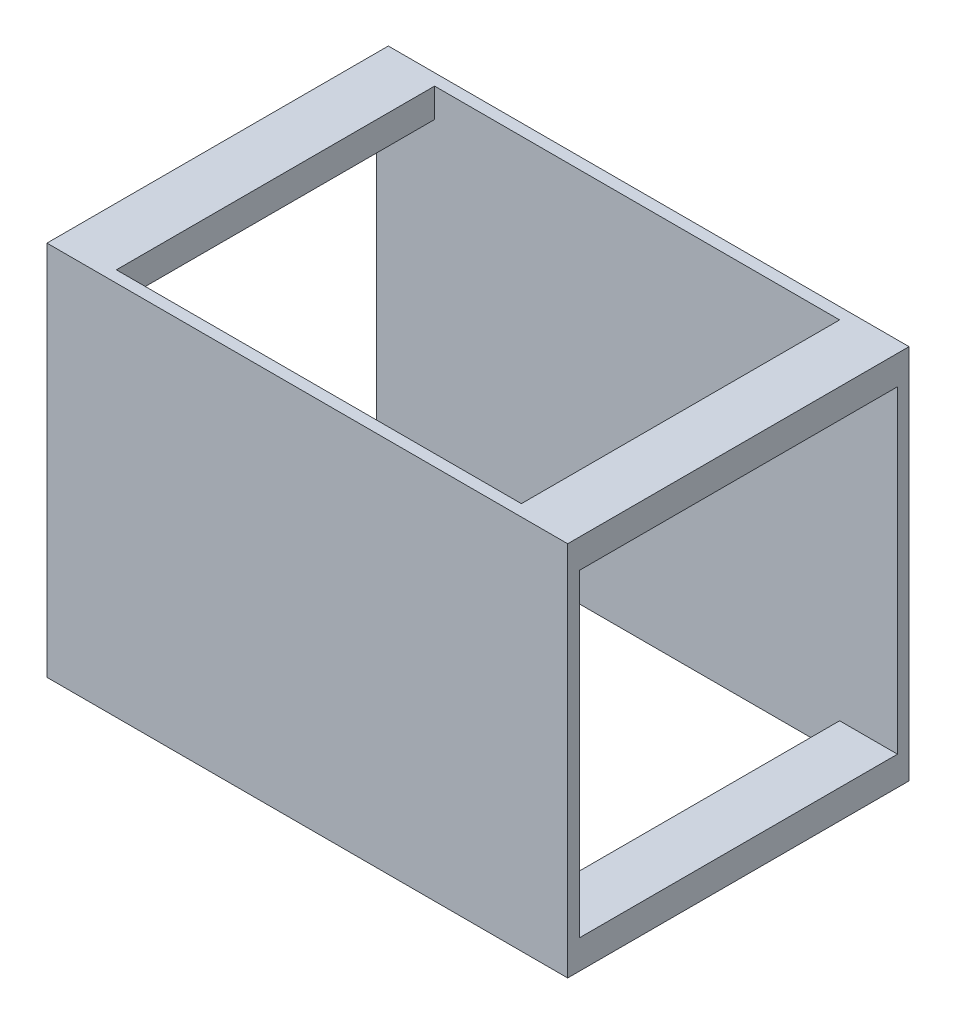
ISO-10303-21;
HEADER;
FILE_DESCRIPTION(('STEP AP214'),'2;1');
FILE_NAME('part.step','',(''),(''),'','','');
FILE_SCHEMA(('AUTOMOTIVE_DESIGN { 1 0 10303 214 1 1 1 1 }'));
ENDSEC;
DATA;
#1=APPLICATION_CONTEXT('core data for automotive mechanical design processes');
#2=APPLICATION_PROTOCOL_DEFINITION('international standard','automotive_design',2000,#1);
#3=PRODUCT_CONTEXT('',#1,'mechanical');
#4=PRODUCT('Part','Part','',(#3));
#5=PRODUCT_RELATED_PRODUCT_CATEGORY('part','',(#4));
#6=PRODUCT_DEFINITION_FORMATION('','',#4);
#7=PRODUCT_DEFINITION_CONTEXT('part definition',#1,'design');
#8=PRODUCT_DEFINITION('design','',#6,#7);
#9=PRODUCT_DEFINITION_SHAPE('','',#8);
#10=(LENGTH_UNIT() NAMED_UNIT(*) SI_UNIT(.MILLI.,.METRE.));
#11=(NAMED_UNIT(*) PLANE_ANGLE_UNIT() SI_UNIT($,.RADIAN.));
#12=(NAMED_UNIT(*) SI_UNIT($,.STERADIAN.) SOLID_ANGLE_UNIT());
#13=UNCERTAINTY_MEASURE_WITH_UNIT(LENGTH_MEASURE(1.E-05),#10,'distance_accuracy_value','');
#14=(GEOMETRIC_REPRESENTATION_CONTEXT(3) GLOBAL_UNCERTAINTY_ASSIGNED_CONTEXT((#13)) GLOBAL_UNIT_ASSIGNED_CONTEXT((#10,
#11,#12)) REPRESENTATION_CONTEXT('',''));
#15=CARTESIAN_POINT('',(0.,0.,0.));
#16=DIRECTION('',(0.,0.,1.));
#17=DIRECTION('',(1.,0.,0.));
#18=AXIS2_PLACEMENT_3D('',#15,#16,#17);
#19=CARTESIAN_POINT('',(0.,0.,2.));
#20=DIRECTION('',(0.,0.,1.));
#21=DIRECTION('',(1.,0.,0.));
#22=AXIS2_PLACEMENT_3D('',#19,#20,#21);
#23=PLANE('',#22);
#24=DIRECTION('',(0.,-1.,0.));
#25=VECTOR('',#24,1.);
#26=CARTESIAN_POINT('',(35.,-32.5,2.));
#27=LINE('',#26,#25);
#28=CARTESIAN_POINT('',(35.,-27.5,2.));
#29=VERTEX_POINT('',#28);
#30=CARTESIAN_POINT('',(35.,-32.5,2.));
#31=VERTEX_POINT('',#30);
#32=EDGE_CURVE('E61',#29,#31,#27,.T.);
#33=ORIENTED_EDGE('',*,*,#32,.F.);
#34=DIRECTION('',(-1.,0.,0.));
#35=VECTOR('',#34,1.);
#36=CARTESIAN_POINT('',(45.,-27.5,2.));
#37=LINE('',#36,#35);
#38=CARTESIAN_POINT('',(45.,-27.5,2.));
#39=VERTEX_POINT('',#38);
#40=EDGE_CURVE('E65',#39,#29,#37,.T.);
#41=ORIENTED_EDGE('',*,*,#40,.F.);
#42=DIRECTION('',(0.,1.,0.));
#43=VECTOR('',#42,1.);
#44=CARTESIAN_POINT('',(45.,32.5,2.));
#45=LINE('',#44,#43);
#46=CARTESIAN_POINT('',(45.,27.5,2.));
#47=VERTEX_POINT('',#46);
#48=EDGE_CURVE('E306',#39,#47,#45,.T.);
#49=ORIENTED_EDGE('',*,*,#48,.T.);
#50=DIRECTION('',(-1.,0.,0.));
#51=VECTOR('',#50,1.);
#52=CARTESIAN_POINT('',(45.,27.5,2.));
#53=LINE('',#52,#51);
#54=CARTESIAN_POINT('',(35.,27.5,2.));
#55=VERTEX_POINT('',#54);
#56=EDGE_CURVE('E232',#47,#55,#53,.T.);
#57=ORIENTED_EDGE('',*,*,#56,.T.);
#58=DIRECTION('',(0.,1.,0.));
#59=VECTOR('',#58,1.);
#60=CARTESIAN_POINT('',(35.,32.5,2.));
#61=LINE('',#60,#59);
#62=CARTESIAN_POINT('',(35.,32.5,2.));
#63=VERTEX_POINT('',#62);
#64=EDGE_CURVE('E226',#55,#63,#61,.T.);
#65=ORIENTED_EDGE('',*,*,#64,.T.);
#66=DIRECTION('',(-1.,0.,0.));
#67=VECTOR('',#66,1.);
#68=CARTESIAN_POINT('',(-45.,32.5,2.));
#69=LINE('',#68,#67);
#70=CARTESIAN_POINT('',(-35.,32.5,2.));
#71=VERTEX_POINT('',#70);
#72=EDGE_CURVE('E309',#63,#71,#69,.T.);
#73=ORIENTED_EDGE('',*,*,#72,.T.);
#74=DIRECTION('',(0.,1.,0.));
#75=VECTOR('',#74,1.);
#76=CARTESIAN_POINT('',(-35.,32.5,2.));
#77=LINE('',#76,#75);
#78=CARTESIAN_POINT('',(-35.,27.5,2.));
#79=VERTEX_POINT('',#78);
#80=EDGE_CURVE('E284',#79,#71,#77,.T.);
#81=ORIENTED_EDGE('',*,*,#80,.F.);
#82=DIRECTION('',(1.,0.,0.));
#83=VECTOR('',#82,1.);
#84=CARTESIAN_POINT('',(-45.,27.5,2.));
#85=LINE('',#84,#83);
#86=CARTESIAN_POINT('',(-45.,27.5,2.));
#87=VERTEX_POINT('',#86);
#88=EDGE_CURVE('E278',#87,#79,#85,.T.);
#89=ORIENTED_EDGE('',*,*,#88,.F.);
#90=DIRECTION('',(0.,-1.,0.));
#91=VECTOR('',#90,1.);
#92=CARTESIAN_POINT('',(-45.,32.5,2.));
#93=LINE('',#92,#91);
#94=CARTESIAN_POINT('',(-45.,-27.5,2.));
#95=VERTEX_POINT('',#94);
#96=EDGE_CURVE('E313',#87,#95,#93,.T.);
#97=ORIENTED_EDGE('',*,*,#96,.T.);
#98=DIRECTION('',(1.,0.,0.));
#99=VECTOR('',#98,1.);
#100=CARTESIAN_POINT('',(-45.,-27.5,2.));
#101=LINE('',#100,#99);
#102=CARTESIAN_POINT('',(-35.,-27.5,2.));
#103=VERTEX_POINT('',#102);
#104=EDGE_CURVE('E258',#95,#103,#101,.T.);
#105=ORIENTED_EDGE('',*,*,#104,.T.);
#106=DIRECTION('',(0.,-1.,0.));
#107=VECTOR('',#106,1.);
#108=CARTESIAN_POINT('',(-35.,-32.5,2.));
#109=LINE('',#108,#107);
#110=CARTESIAN_POINT('',(-35.,-32.5,2.));
#111=VERTEX_POINT('',#110);
#112=EDGE_CURVE('E252',#103,#111,#109,.T.);
#113=ORIENTED_EDGE('',*,*,#112,.T.);
#114=DIRECTION('',(1.,0.,0.));
#115=VECTOR('',#114,1.);
#116=CARTESIAN_POINT('',(-45.,-32.5,2.));
#117=LINE('',#116,#115);
#118=EDGE_CURVE('E316',#111,#31,#117,.T.);
#119=ORIENTED_EDGE('',*,*,#118,.T.);
#120=EDGE_LOOP('',(#33,#41,#49,#57,#65,#73,#81,#89,#97,#105,#113,#119));
#121=FACE_BOUND('',#120,.T.);
#122=ADVANCED_FACE('F45',(#121),#23,.T.);
#123=CARTESIAN_POINT('',(45.,32.5,2.));
#124=DIRECTION('',(-1.,0.,0.));
#125=DIRECTION('',(0.,-1.,0.));
#126=AXIS2_PLACEMENT_3D('',#123,#124,#125);
#127=PLANE('',#126);
#128=DIRECTION('',(0.,1.,0.));
#129=VECTOR('',#128,1.);
#130=CARTESIAN_POINT('',(45.,32.5,57.));
#131=LINE('',#130,#129);
#132=CARTESIAN_POINT('',(45.,-27.5,57.));
#133=VERTEX_POINT('',#132);
#134=CARTESIAN_POINT('',(45.,27.5,57.));
#135=VERTEX_POINT('',#134);
#136=EDGE_CURVE('E191',#133,#135,#131,.T.);
#137=ORIENTED_EDGE('',*,*,#136,.T.);
#138=DIRECTION('',(0.,0.,-1.));
#139=VECTOR('',#138,1.);
#140=CARTESIAN_POINT('',(45.,27.5,57.));
#141=LINE('',#140,#139);
#142=EDGE_CURVE('E236',#135,#47,#141,.T.);
#143=ORIENTED_EDGE('',*,*,#142,.T.);
#144=ORIENTED_EDGE('',*,*,#48,.F.);
#145=DIRECTION('',(0.,0.,-1.));
#146=VECTOR('',#145,1.);
#147=CARTESIAN_POINT('',(45.,-27.5,57.));
#148=LINE('',#147,#146);
#149=EDGE_CURVE('E222',#133,#39,#148,.T.);
#150=ORIENTED_EDGE('',*,*,#149,.F.);
#151=EDGE_LOOP('',(#137,#143,#144,#150));
#152=FACE_BOUND('',#151,.T.);
#153=DIRECTION('',(0.,1.,0.));
#154=VECTOR('',#153,1.);
#155=CARTESIAN_POINT('',(45.,32.5,0.));
#156=LINE('',#155,#154);
#157=CARTESIAN_POINT('',(45.,-32.5,0.));
#158=VERTEX_POINT('',#157);
#159=CARTESIAN_POINT('',(45.,32.5,0.));
#160=VERTEX_POINT('',#159);
#161=EDGE_CURVE('E162',#158,#160,#156,.T.);
#162=ORIENTED_EDGE('',*,*,#161,.T.);
#163=DIRECTION('',(0.,0.,-1.));
#164=VECTOR('',#163,1.);
#165=CARTESIAN_POINT('',(45.,32.5,2.));
#166=LINE('',#165,#164);
#167=CARTESIAN_POINT('',(45.,32.5,59.));
#168=VERTEX_POINT('',#167);
#169=EDGE_CURVE('E11',#168,#160,#166,.T.);
#170=ORIENTED_EDGE('',*,*,#169,.F.);
#171=DIRECTION('',(0.,1.,0.));
#172=VECTOR('',#171,1.);
#173=CARTESIAN_POINT('',(45.,32.5,59.));
#174=LINE('',#173,#172);
#175=CARTESIAN_POINT('',(45.,-32.5,59.));
#176=VERTEX_POINT('',#175);
#177=EDGE_CURVE('E160',#176,#168,#174,.T.);
#178=ORIENTED_EDGE('',*,*,#177,.F.);
#179=DIRECTION('',(0.,0.,-1.));
#180=VECTOR('',#179,1.);
#181=CARTESIAN_POINT('',(45.,-32.5,2.));
#182=LINE('',#181,#180);
#183=EDGE_CURVE('E319',#176,#158,#182,.T.);
#184=ORIENTED_EDGE('',*,*,#183,.T.);
#185=EDGE_LOOP('',(#162,#170,#178,#184));
#186=FACE_BOUND('',#185,.T.);
#187=ADVANCED_FACE('F47',(#152,#186),#127,.F.);
#188=CARTESIAN_POINT('',(-45.,32.5,2.));
#189=DIRECTION('',(0.,-1.,0.));
#190=DIRECTION('',(0.,0.,-1.));
#191=AXIS2_PLACEMENT_3D('',#188,#189,#190);
#192=PLANE('',#191);
#193=DIRECTION('',(0.,0.,-1.));
#194=VECTOR('',#193,1.);
#195=CARTESIAN_POINT('',(-45.,32.5,2.));
#196=LINE('',#195,#194);
#197=CARTESIAN_POINT('',(-45.,32.5,59.));
#198=VERTEX_POINT('',#197);
#199=CARTESIAN_POINT('',(-45.,32.5,0.));
#200=VERTEX_POINT('',#199);
#201=EDGE_CURVE('E54',#198,#200,#196,.T.);
#202=ORIENTED_EDGE('',*,*,#201,.F.);
#203=DIRECTION('',(-1.,0.,0.));
#204=VECTOR('',#203,1.);
#205=CARTESIAN_POINT('',(-45.,32.5,59.));
#206=LINE('',#205,#204);
#207=EDGE_CURVE('E165',#168,#198,#206,.T.);
#208=ORIENTED_EDGE('',*,*,#207,.F.);
#209=ORIENTED_EDGE('',*,*,#169,.T.);
#210=DIRECTION('',(-1.,0.,0.));
#211=VECTOR('',#210,1.);
#212=CARTESIAN_POINT('',(-45.,32.5,0.));
#213=LINE('',#212,#211);
#214=EDGE_CURVE('E322',#160,#200,#213,.T.);
#215=ORIENTED_EDGE('',*,*,#214,.T.);
#216=EDGE_LOOP('',(#202,#208,#209,#215));
#217=FACE_BOUND('',#216,.T.);
#218=DIRECTION('',(-1.,0.,0.));
#219=VECTOR('',#218,1.);
#220=CARTESIAN_POINT('',(-45.,32.5,57.));
#221=LINE('',#220,#219);
#222=CARTESIAN_POINT('',(35.,32.5,57.));
#223=VERTEX_POINT('',#222);
#224=CARTESIAN_POINT('',(-35.,32.5,57.));
#225=VERTEX_POINT('',#224);
#226=EDGE_CURVE('E195',#223,#225,#221,.T.);
#227=ORIENTED_EDGE('',*,*,#226,.T.);
#228=DIRECTION('',(0.,0.,-1.));
#229=VECTOR('',#228,1.);
#230=CARTESIAN_POINT('',(-35.,32.5,57.));
#231=LINE('',#230,#229);
#232=EDGE_CURVE('E288',#225,#71,#231,.T.);
#233=ORIENTED_EDGE('',*,*,#232,.T.);
#234=ORIENTED_EDGE('',*,*,#72,.F.);
#235=DIRECTION('',(0.,0.,-1.));
#236=VECTOR('',#235,1.);
#237=CARTESIAN_POINT('',(35.,32.5,57.));
#238=LINE('',#237,#236);
#239=EDGE_CURVE('E248',#223,#63,#238,.T.);
#240=ORIENTED_EDGE('',*,*,#239,.F.);
#241=EDGE_LOOP('',(#227,#233,#234,#240));
#242=FACE_BOUND('',#241,.T.);
#243=ADVANCED_FACE('F166',(#217,#242),#192,.F.);
#244=CARTESIAN_POINT('',(-45.,32.5,2.));
#245=DIRECTION('',(1.,0.,0.));
#246=DIRECTION('',(0.,0.,-1.));
#247=AXIS2_PLACEMENT_3D('',#244,#245,#246);
#248=PLANE('',#247);
#249=DIRECTION('',(0.,0.,-1.));
#250=VECTOR('',#249,1.);
#251=CARTESIAN_POINT('',(-45.,27.5,57.));
#252=LINE('',#251,#250);
#253=CARTESIAN_POINT('',(-45.,27.5,57.));
#254=VERTEX_POINT('',#253);
#255=EDGE_CURVE('E302',#254,#87,#252,.T.);
#256=ORIENTED_EDGE('',*,*,#255,.F.);
#257=DIRECTION('',(0.,-1.,0.));
#258=VECTOR('',#257,1.);
#259=CARTESIAN_POINT('',(-45.,32.5,57.));
#260=LINE('',#259,#258);
#261=CARTESIAN_POINT('',(-45.,-27.5,57.));
#262=VERTEX_POINT('',#261);
#263=EDGE_CURVE('E184',#254,#262,#260,.T.);
#264=ORIENTED_EDGE('',*,*,#263,.T.);
#265=DIRECTION('',(0.,0.,-1.));
#266=VECTOR('',#265,1.);
#267=CARTESIAN_POINT('',(-45.,-27.5,57.));
#268=LINE('',#267,#266);
#269=EDGE_CURVE('E262',#262,#95,#268,.T.);
#270=ORIENTED_EDGE('',*,*,#269,.T.);
#271=ORIENTED_EDGE('',*,*,#96,.F.);
#272=EDGE_LOOP('',(#256,#264,#270,#271));
#273=FACE_BOUND('',#272,.T.);
#274=DIRECTION('',(0.,-1.,0.));
#275=VECTOR('',#274,1.);
#276=CARTESIAN_POINT('',(-45.,32.5,0.));
#277=LINE('',#276,#275);
#278=CARTESIAN_POINT('',(-45.,-32.5,0.));
#279=VERTEX_POINT('',#278);
#280=EDGE_CURVE('E325',#200,#279,#277,.T.);
#281=ORIENTED_EDGE('',*,*,#280,.T.);
#282=DIRECTION('',(0.,0.,-1.));
#283=VECTOR('',#282,1.);
#284=CARTESIAN_POINT('',(-45.,-32.5,2.));
#285=LINE('',#284,#283);
#286=CARTESIAN_POINT('',(-45.,-32.5,59.));
#287=VERTEX_POINT('',#286);
#288=EDGE_CURVE('E332',#287,#279,#285,.T.);
#289=ORIENTED_EDGE('',*,*,#288,.F.);
#290=DIRECTION('',(0.,-1.,0.));
#291=VECTOR('',#290,1.);
#292=CARTESIAN_POINT('',(-45.,32.5,59.));
#293=LINE('',#292,#291);
#294=EDGE_CURVE('E173',#198,#287,#293,.T.);
#295=ORIENTED_EDGE('',*,*,#294,.F.);
#296=ORIENTED_EDGE('',*,*,#201,.T.);
#297=EDGE_LOOP('',(#281,#289,#295,#296));
#298=FACE_BOUND('',#297,.T.);
#299=ADVANCED_FACE('F338',(#273,#298),#248,.F.);
#300=CARTESIAN_POINT('',(-45.,-32.5,2.));
#301=DIRECTION('',(0.,1.,0.));
#302=DIRECTION('',(0.,0.,1.));
#303=AXIS2_PLACEMENT_3D('',#300,#301,#302);
#304=PLANE('',#303);
#305=DIRECTION('',(1.,0.,0.));
#306=VECTOR('',#305,1.);
#307=CARTESIAN_POINT('',(-45.,-32.5,59.));
#308=LINE('',#307,#306);
#309=EDGE_CURVE('E178',#287,#176,#308,.T.);
#310=ORIENTED_EDGE('',*,*,#309,.F.);
#311=ORIENTED_EDGE('',*,*,#288,.T.);
#312=DIRECTION('',(1.,0.,0.));
#313=VECTOR('',#312,1.);
#314=CARTESIAN_POINT('',(-45.,-32.5,0.));
#315=LINE('',#314,#313);
#316=EDGE_CURVE('E310',#279,#158,#315,.T.);
#317=ORIENTED_EDGE('',*,*,#316,.T.);
#318=ORIENTED_EDGE('',*,*,#183,.F.);
#319=EDGE_LOOP('',(#310,#311,#317,#318));
#320=FACE_BOUND('',#319,.T.);
#321=DIRECTION('',(0.,0.,-1.));
#322=VECTOR('',#321,1.);
#323=CARTESIAN_POINT('',(-35.,-32.5,57.));
#324=LINE('',#323,#322);
#325=CARTESIAN_POINT('',(-35.,-32.5,57.));
#326=VERTEX_POINT('',#325);
#327=EDGE_CURVE('E274',#326,#111,#324,.T.);
#328=ORIENTED_EDGE('',*,*,#327,.F.);
#329=DIRECTION('',(1.,0.,0.));
#330=VECTOR('',#329,1.);
#331=CARTESIAN_POINT('',(-45.,-32.5,57.));
#332=LINE('',#331,#330);
#333=CARTESIAN_POINT('',(35.,-32.5,57.));
#334=VERTEX_POINT('',#333);
#335=EDGE_CURVE('E180',#326,#334,#332,.T.);
#336=ORIENTED_EDGE('',*,*,#335,.T.);
#337=DIRECTION('',(0.,0.,-1.));
#338=VECTOR('',#337,1.);
#339=CARTESIAN_POINT('',(35.,-32.5,57.));
#340=LINE('',#339,#338);
#341=EDGE_CURVE('E210',#334,#31,#340,.T.);
#342=ORIENTED_EDGE('',*,*,#341,.T.);
#343=ORIENTED_EDGE('',*,*,#118,.F.);
#344=EDGE_LOOP('',(#328,#336,#342,#343));
#345=FACE_BOUND('',#344,.T.);
#346=ADVANCED_FACE('F343',(#320,#345),#304,.F.);
#347=CARTESIAN_POINT('',(0.,0.,0.));
#348=DIRECTION('',(0.,0.,1.));
#349=DIRECTION('',(1.,0.,0.));
#350=AXIS2_PLACEMENT_3D('',#347,#348,#349);
#351=PLANE('',#350);
#352=ORIENTED_EDGE('',*,*,#161,.F.);
#353=ORIENTED_EDGE('',*,*,#316,.F.);
#354=ORIENTED_EDGE('',*,*,#280,.F.);
#355=ORIENTED_EDGE('',*,*,#214,.F.);
#356=EDGE_LOOP('',(#352,#353,#354,#355));
#357=FACE_BOUND('',#356,.T.);
#358=ADVANCED_FACE('F341',(#357),#351,.F.);
#359=CARTESIAN_POINT('',(-45.,27.5,57.));
#360=DIRECTION('',(0.,1.,0.));
#361=DIRECTION('',(0.,0.,1.));
#362=AXIS2_PLACEMENT_3D('',#359,#360,#361);
#363=PLANE('',#362);
#364=ORIENTED_EDGE('',*,*,#88,.T.);
#365=DIRECTION('',(0.,0.,-1.));
#366=VECTOR('',#365,1.);
#367=CARTESIAN_POINT('',(-35.,27.5,57.));
#368=LINE('',#367,#366);
#369=CARTESIAN_POINT('',(-35.,27.5,57.));
#370=VERTEX_POINT('',#369);
#371=EDGE_CURVE('E298',#370,#79,#368,.T.);
#372=ORIENTED_EDGE('',*,*,#371,.F.);
#373=DIRECTION('',(1.,0.,0.));
#374=VECTOR('',#373,1.);
#375=CARTESIAN_POINT('',(-45.,27.5,57.));
#376=LINE('',#375,#374);
#377=EDGE_CURVE('E279',#254,#370,#376,.T.);
#378=ORIENTED_EDGE('',*,*,#377,.F.);
#379=ORIENTED_EDGE('',*,*,#255,.T.);
#380=EDGE_LOOP('',(#364,#372,#378,#379));
#381=FACE_BOUND('',#380,.T.);
#382=ADVANCED_FACE('F392',(#381),#363,.F.);
#383=CARTESIAN_POINT('',(-35.,32.5,57.));
#384=DIRECTION('',(-1.,0.,0.));
#385=DIRECTION('',(0.,0.,1.));
#386=AXIS2_PLACEMENT_3D('',#383,#384,#385);
#387=PLANE('',#386);
#388=ORIENTED_EDGE('',*,*,#80,.T.);
#389=ORIENTED_EDGE('',*,*,#232,.F.);
#390=DIRECTION('',(0.,1.,0.));
#391=VECTOR('',#390,1.);
#392=CARTESIAN_POINT('',(-35.,32.5,57.));
#393=LINE('',#392,#391);
#394=EDGE_CURVE('E283',#370,#225,#393,.T.);
#395=ORIENTED_EDGE('',*,*,#394,.F.);
#396=ORIENTED_EDGE('',*,*,#371,.T.);
#397=EDGE_LOOP('',(#388,#389,#395,#396));
#398=FACE_BOUND('',#397,.T.);
#399=ADVANCED_FACE('F420',(#398),#387,.F.);
#400=CARTESIAN_POINT('',(-35.,-32.5,57.));
#401=DIRECTION('',(1.,0.,0.));
#402=DIRECTION('',(0.,0.,-1.));
#403=AXIS2_PLACEMENT_3D('',#400,#401,#402);
#404=PLANE('',#403);
#405=ORIENTED_EDGE('',*,*,#112,.F.);
#406=DIRECTION('',(0.,0.,-1.));
#407=VECTOR('',#406,1.);
#408=CARTESIAN_POINT('',(-35.,-27.5,57.));
#409=LINE('',#408,#407);
#410=CARTESIAN_POINT('',(-35.,-27.5,57.));
#411=VERTEX_POINT('',#410);
#412=EDGE_CURVE('E270',#411,#103,#409,.T.);
#413=ORIENTED_EDGE('',*,*,#412,.F.);
#414=DIRECTION('',(0.,-1.,0.));
#415=VECTOR('',#414,1.);
#416=CARTESIAN_POINT('',(-35.,-32.5,57.));
#417=LINE('',#416,#415);
#418=EDGE_CURVE('E253',#411,#326,#417,.T.);
#419=ORIENTED_EDGE('',*,*,#418,.T.);
#420=ORIENTED_EDGE('',*,*,#327,.T.);
#421=EDGE_LOOP('',(#405,#413,#419,#420));
#422=FACE_BOUND('',#421,.T.);
#423=ADVANCED_FACE('F352',(#422),#404,.T.);
#424=CARTESIAN_POINT('',(-45.,-27.5,57.));
#425=DIRECTION('',(0.,1.,0.));
#426=DIRECTION('',(0.,0.,1.));
#427=AXIS2_PLACEMENT_3D('',#424,#425,#426);
#428=PLANE('',#427);
#429=ORIENTED_EDGE('',*,*,#104,.F.);
#430=ORIENTED_EDGE('',*,*,#269,.F.);
#431=DIRECTION('',(1.,0.,0.));
#432=VECTOR('',#431,1.);
#433=CARTESIAN_POINT('',(-45.,-27.5,57.));
#434=LINE('',#433,#432);
#435=EDGE_CURVE('E257',#262,#411,#434,.T.);
#436=ORIENTED_EDGE('',*,*,#435,.T.);
#437=ORIENTED_EDGE('',*,*,#412,.T.);
#438=EDGE_LOOP('',(#429,#430,#436,#437));
#439=FACE_BOUND('',#438,.T.);
#440=ADVANCED_FACE('F375',(#439),#428,.T.);
#441=CARTESIAN_POINT('',(35.,32.5,57.));
#442=DIRECTION('',(-1.,0.,0.));
#443=DIRECTION('',(0.,0.,1.));
#444=AXIS2_PLACEMENT_3D('',#441,#442,#443);
#445=PLANE('',#444);
#446=ORIENTED_EDGE('',*,*,#64,.F.);
#447=DIRECTION('',(0.,0.,-1.));
#448=VECTOR('',#447,1.);
#449=CARTESIAN_POINT('',(35.,27.5,57.));
#450=LINE('',#449,#448);
#451=CARTESIAN_POINT('',(35.,27.5,57.));
#452=VERTEX_POINT('',#451);
#453=EDGE_CURVE('E244',#452,#55,#450,.T.);
#454=ORIENTED_EDGE('',*,*,#453,.F.);
#455=DIRECTION('',(0.,1.,0.));
#456=VECTOR('',#455,1.);
#457=CARTESIAN_POINT('',(35.,32.5,57.));
#458=LINE('',#457,#456);
#459=EDGE_CURVE('E227',#452,#223,#458,.T.);
#460=ORIENTED_EDGE('',*,*,#459,.T.);
#461=ORIENTED_EDGE('',*,*,#239,.T.);
#462=EDGE_LOOP('',(#446,#454,#460,#461));
#463=FACE_BOUND('',#462,.T.);
#464=ADVANCED_FACE('F373',(#463),#445,.T.);
#465=CARTESIAN_POINT('',(45.,27.5,57.));
#466=DIRECTION('',(0.,-1.,0.));
#467=DIRECTION('',(0.,0.,-1.));
#468=AXIS2_PLACEMENT_3D('',#465,#466,#467);
#469=PLANE('',#468);
#470=ORIENTED_EDGE('',*,*,#56,.F.);
#471=ORIENTED_EDGE('',*,*,#142,.F.);
#472=DIRECTION('',(-1.,0.,0.));
#473=VECTOR('',#472,1.);
#474=CARTESIAN_POINT('',(45.,27.5,57.));
#475=LINE('',#474,#473);
#476=EDGE_CURVE('E231',#135,#452,#475,.T.);
#477=ORIENTED_EDGE('',*,*,#476,.T.);
#478=ORIENTED_EDGE('',*,*,#453,.T.);
#479=EDGE_LOOP('',(#470,#471,#477,#478));
#480=FACE_BOUND('',#479,.T.);
#481=ADVANCED_FACE('F368',(#480),#469,.T.);
#482=CARTESIAN_POINT('',(45.,-27.5,57.));
#483=DIRECTION('',(0.,-1.,0.));
#484=DIRECTION('',(0.,0.,-1.));
#485=AXIS2_PLACEMENT_3D('',#482,#483,#484);
#486=PLANE('',#485);
#487=ORIENTED_EDGE('',*,*,#40,.T.);
#488=DIRECTION('',(0.,0.,-1.));
#489=VECTOR('',#488,1.);
#490=CARTESIAN_POINT('',(35.,-27.5,57.));
#491=LINE('',#490,#489);
#492=CARTESIAN_POINT('',(35.,-27.5,57.));
#493=VERTEX_POINT('',#492);
#494=EDGE_CURVE('E218',#493,#29,#491,.T.);
#495=ORIENTED_EDGE('',*,*,#494,.F.);
#496=DIRECTION('',(-1.,0.,0.));
#497=VECTOR('',#496,1.);
#498=CARTESIAN_POINT('',(45.,-27.5,57.));
#499=LINE('',#498,#497);
#500=EDGE_CURVE('E202',#133,#493,#499,.T.);
#501=ORIENTED_EDGE('',*,*,#500,.F.);
#502=ORIENTED_EDGE('',*,*,#149,.T.);
#503=EDGE_LOOP('',(#487,#495,#501,#502));
#504=FACE_BOUND('',#503,.T.);
#505=ADVANCED_FACE('F361',(#504),#486,.F.);
#506=CARTESIAN_POINT('',(35.,-32.5,57.));
#507=DIRECTION('',(1.,0.,0.));
#508=DIRECTION('',(0.,0.,-1.));
#509=AXIS2_PLACEMENT_3D('',#506,#507,#508);
#510=PLANE('',#509);
#511=ORIENTED_EDGE('',*,*,#32,.T.);
#512=ORIENTED_EDGE('',*,*,#341,.F.);
#513=DIRECTION('',(0.,-1.,0.));
#514=VECTOR('',#513,1.);
#515=CARTESIAN_POINT('',(35.,-32.5,57.));
#516=LINE('',#515,#514);
#517=EDGE_CURVE('E206',#493,#334,#516,.T.);
#518=ORIENTED_EDGE('',*,*,#517,.F.);
#519=ORIENTED_EDGE('',*,*,#494,.T.);
#520=EDGE_LOOP('',(#511,#512,#518,#519));
#521=FACE_BOUND('',#520,.T.);
#522=ADVANCED_FACE('F359',(#521),#510,.F.);
#523=CARTESIAN_POINT('',(0.,0.,57.));
#524=DIRECTION('',(0.,0.,1.));
#525=DIRECTION('',(1.,0.,0.));
#526=AXIS2_PLACEMENT_3D('',#523,#524,#525);
#527=PLANE('',#526);
#528=ORIENTED_EDGE('',*,*,#263,.F.);
#529=ORIENTED_EDGE('',*,*,#377,.T.);
#530=ORIENTED_EDGE('',*,*,#394,.T.);
#531=ORIENTED_EDGE('',*,*,#226,.F.);
#532=ORIENTED_EDGE('',*,*,#459,.F.);
#533=ORIENTED_EDGE('',*,*,#476,.F.);
#534=ORIENTED_EDGE('',*,*,#136,.F.);
#535=ORIENTED_EDGE('',*,*,#500,.T.);
#536=ORIENTED_EDGE('',*,*,#517,.T.);
#537=ORIENTED_EDGE('',*,*,#335,.F.);
#538=ORIENTED_EDGE('',*,*,#418,.F.);
#539=ORIENTED_EDGE('',*,*,#435,.F.);
#540=EDGE_LOOP('',(#528,#529,#530,#531,#532,#533,#534,#535,#536,#537,#538,#539));
#541=FACE_BOUND('',#540,.T.);
#542=ADVANCED_FACE('F355',(#541),#527,.F.);
#543=CARTESIAN_POINT('',(0.,0.,59.));
#544=DIRECTION('',(0.,0.,1.));
#545=DIRECTION('',(1.,0.,0.));
#546=AXIS2_PLACEMENT_3D('',#543,#544,#545);
#547=PLANE('',#546);
#548=ORIENTED_EDGE('',*,*,#177,.T.);
#549=ORIENTED_EDGE('',*,*,#207,.T.);
#550=ORIENTED_EDGE('',*,*,#294,.T.);
#551=ORIENTED_EDGE('',*,*,#309,.T.);
#552=EDGE_LOOP('',(#548,#549,#550,#551));
#553=FACE_BOUND('',#552,.T.);
#554=ADVANCED_FACE('F176',(#553),#547,.T.);
#555=CLOSED_SHELL('',(#122,#187,#243,#299,#346,#358,#382,#399,#423,#440,#464,#481,#505,#522,
#542,#554));
#556=MANIFOLD_SOLID_BREP('B2',#555);
#557=ADVANCED_BREP_SHAPE_REPRESENTATION('',(#18,#556),#14);
#558=SHAPE_DEFINITION_REPRESENTATION(#9,#557);
ENDSEC;
END-ISO-10303-21;
